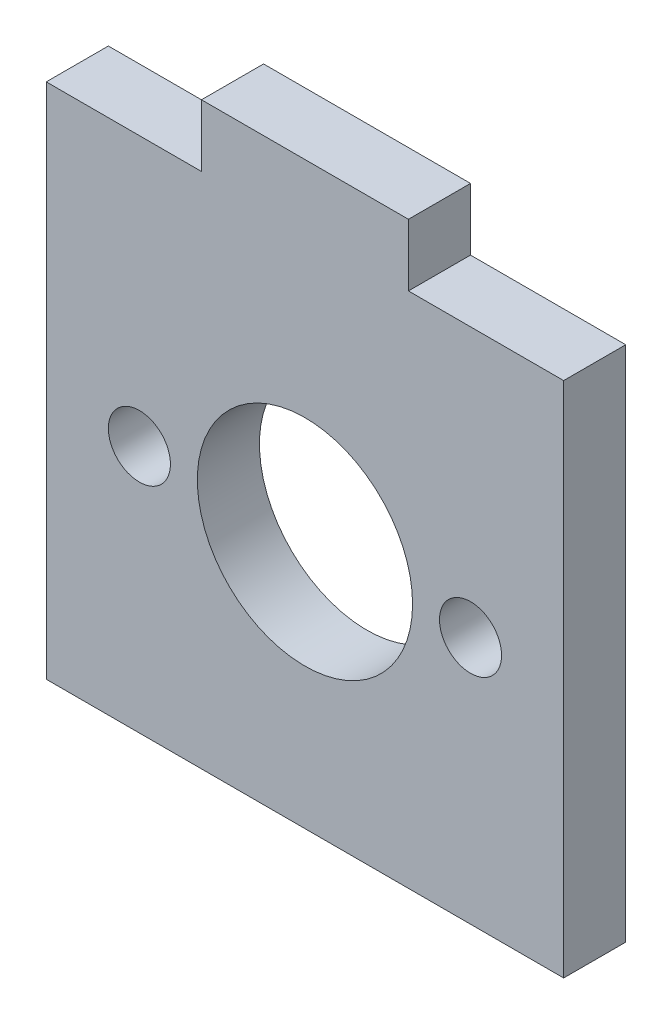
ISO-10303-21;
HEADER;
FILE_DESCRIPTION(('STEP AP214'),'2;1');
FILE_NAME('part.step','',(''),(''),'','','');
FILE_SCHEMA(('AUTOMOTIVE_DESIGN { 1 0 10303 214 1 1 1 1 }'));
ENDSEC;
DATA;
#1=APPLICATION_CONTEXT('core data for automotive mechanical design processes');
#2=APPLICATION_PROTOCOL_DEFINITION('international standard','automotive_design',2000,#1);
#3=PRODUCT_CONTEXT('',#1,'mechanical');
#4=PRODUCT('Part','Part','',(#3));
#5=PRODUCT_RELATED_PRODUCT_CATEGORY('part','',(#4));
#6=PRODUCT_DEFINITION_FORMATION('','',#4);
#7=PRODUCT_DEFINITION_CONTEXT('part definition',#1,'design');
#8=PRODUCT_DEFINITION('design','',#6,#7);
#9=PRODUCT_DEFINITION_SHAPE('','',#8);
#10=(LENGTH_UNIT() NAMED_UNIT(*) SI_UNIT(.MILLI.,.METRE.));
#11=(NAMED_UNIT(*) PLANE_ANGLE_UNIT() SI_UNIT($,.RADIAN.));
#12=(NAMED_UNIT(*) SI_UNIT($,.STERADIAN.) SOLID_ANGLE_UNIT());
#13=UNCERTAINTY_MEASURE_WITH_UNIT(LENGTH_MEASURE(1.E-05),#10,'distance_accuracy_value','');
#14=(GEOMETRIC_REPRESENTATION_CONTEXT(3) GLOBAL_UNCERTAINTY_ASSIGNED_CONTEXT((#13)) GLOBAL_UNIT_ASSIGNED_CONTEXT((#10,
#11,#12)) REPRESENTATION_CONTEXT('',''));
#15=CARTESIAN_POINT('',(0.,0.,0.));
#16=DIRECTION('',(0.,0.,1.));
#17=DIRECTION('',(1.,0.,0.));
#18=AXIS2_PLACEMENT_3D('',#15,#16,#17);
#19=CARTESIAN_POINT('',(0.,0.,3.));
#20=DIRECTION('',(0.,0.,1.));
#21=DIRECTION('',(1.,0.,0.));
#22=AXIS2_PLACEMENT_3D('',#19,#20,#21);
#23=PLANE('',#22);
#24=CARTESIAN_POINT('',(-8.,0.,3.));
#25=DIRECTION('',(0.,0.,1.));
#26=DIRECTION('',(1.,0.,0.));
#27=AXIS2_PLACEMENT_3D('',#24,#25,#26);
#28=CIRCLE('',#27,1.5);
#29=CARTESIAN_POINT('',(-6.5,0.,3.));
#30=VERTEX_POINT('',#29);
#31=EDGE_CURVE('E213',#30,#30,#28,.T.);
#32=ORIENTED_EDGE('',*,*,#31,.F.);
#33=EDGE_LOOP('',(#32));
#34=FACE_BOUND('',#33,.T.);
#35=DIRECTION('',(-1.,0.,0.));
#36=VECTOR('',#35,1.);
#37=CARTESIAN_POINT('',(-5.,13.,3.));
#38=LINE('',#37,#36);
#39=CARTESIAN_POINT('',(-5.,13.,3.));
#40=VERTEX_POINT('',#39);
#41=CARTESIAN_POINT('',(-12.5,13.,3.));
#42=VERTEX_POINT('',#41);
#43=EDGE_CURVE('E164',#40,#42,#38,.T.);
#44=ORIENTED_EDGE('',*,*,#43,.T.);
#45=DIRECTION('',(0.,-1.,0.));
#46=VECTOR('',#45,1.);
#47=CARTESIAN_POINT('',(-12.5,13.,3.));
#48=LINE('',#47,#46);
#49=CARTESIAN_POINT('',(-12.5,-12.,3.));
#50=VERTEX_POINT('',#49);
#51=EDGE_CURVE('E100',#42,#50,#48,.T.);
#52=ORIENTED_EDGE('',*,*,#51,.T.);
#53=DIRECTION('',(1.,0.,0.));
#54=VECTOR('',#53,1.);
#55=CARTESIAN_POINT('',(-12.5,-12.,3.));
#56=LINE('',#55,#54);
#57=CARTESIAN_POINT('',(12.5,-12.,3.));
#58=VERTEX_POINT('',#57);
#59=EDGE_CURVE('E185',#50,#58,#56,.T.);
#60=ORIENTED_EDGE('',*,*,#59,.T.);
#61=DIRECTION('',(0.,1.,0.));
#62=VECTOR('',#61,1.);
#63=CARTESIAN_POINT('',(12.5,-12.,3.));
#64=LINE('',#63,#62);
#65=CARTESIAN_POINT('',(12.5,13.,3.));
#66=VERTEX_POINT('',#65);
#67=EDGE_CURVE('E199',#58,#66,#64,.T.);
#68=ORIENTED_EDGE('',*,*,#67,.T.);
#69=DIRECTION('',(-1.,0.,0.));
#70=VECTOR('',#69,1.);
#71=CARTESIAN_POINT('',(12.5,13.,3.));
#72=LINE('',#71,#70);
#73=CARTESIAN_POINT('',(5.,13.,3.));
#74=VERTEX_POINT('',#73);
#75=EDGE_CURVE('E119',#66,#74,#72,.T.);
#76=ORIENTED_EDGE('',*,*,#75,.T.);
#77=DIRECTION('',(0.,1.,0.));
#78=VECTOR('',#77,1.);
#79=CARTESIAN_POINT('',(5.,16.,3.));
#80=LINE('',#79,#78);
#81=CARTESIAN_POINT('',(5.,16.,3.));
#82=VERTEX_POINT('',#81);
#83=EDGE_CURVE('E113',#74,#82,#80,.T.);
#84=ORIENTED_EDGE('',*,*,#83,.T.);
#85=DIRECTION('',(-1.,0.,0.));
#86=VECTOR('',#85,1.);
#87=CARTESIAN_POINT('',(-5.,16.,3.));
#88=LINE('',#87,#86);
#89=CARTESIAN_POINT('',(-5.,16.,3.));
#90=VERTEX_POINT('',#89);
#91=EDGE_CURVE('E117',#82,#90,#88,.T.);
#92=ORIENTED_EDGE('',*,*,#91,.T.);
#93=DIRECTION('',(0.,-1.,0.));
#94=VECTOR('',#93,1.);
#95=CARTESIAN_POINT('',(-5.,13.,3.));
#96=LINE('',#95,#94);
#97=EDGE_CURVE('E57',#90,#40,#96,.T.);
#98=ORIENTED_EDGE('',*,*,#97,.T.);
#99=EDGE_LOOP('',(#44,#52,#60,#68,#76,#84,#92,#98));
#100=FACE_BOUND('',#99,.T.);
#101=CARTESIAN_POINT('',(0.,0.,3.));
#102=DIRECTION('',(0.,0.,1.));
#103=DIRECTION('',(1.,0.,0.));
#104=AXIS2_PLACEMENT_3D('',#101,#102,#103);
#105=CIRCLE('',#104,5.2);
#106=CARTESIAN_POINT('',(5.2,0.,3.));
#107=VERTEX_POINT('',#106);
#108=EDGE_CURVE('E146',#107,#107,#105,.T.);
#109=ORIENTED_EDGE('',*,*,#108,.F.);
#110=EDGE_LOOP('',(#109));
#111=FACE_BOUND('',#110,.T.);
#112=CARTESIAN_POINT('',(8.,0.,3.));
#113=DIRECTION('',(0.,0.,1.));
#114=DIRECTION('',(1.,0.,0.));
#115=AXIS2_PLACEMENT_3D('',#112,#113,#114);
#116=CIRCLE('',#115,1.5);
#117=CARTESIAN_POINT('',(9.5,0.,3.));
#118=VERTEX_POINT('',#117);
#119=EDGE_CURVE('E221',#118,#118,#116,.T.);
#120=ORIENTED_EDGE('',*,*,#119,.F.);
#121=EDGE_LOOP('',(#120));
#122=FACE_BOUND('',#121,.T.);
#123=ADVANCED_FACE('F39',(#34,#100,#111,#122),#23,.T.);
#124=CARTESIAN_POINT('',(0.,0.,0.));
#125=DIRECTION('',(0.,0.,1.));
#126=DIRECTION('',(1.,0.,0.));
#127=AXIS2_PLACEMENT_3D('',#124,#125,#126);
#128=PLANE('',#127);
#129=DIRECTION('',(-1.,0.,0.));
#130=VECTOR('',#129,1.);
#131=CARTESIAN_POINT('',(-5.,13.,0.));
#132=LINE('',#131,#130);
#133=CARTESIAN_POINT('',(-5.,13.,0.));
#134=VERTEX_POINT('',#133);
#135=CARTESIAN_POINT('',(-12.5,13.,0.));
#136=VERTEX_POINT('',#135);
#137=EDGE_CURVE('E141',#134,#136,#132,.T.);
#138=ORIENTED_EDGE('',*,*,#137,.F.);
#139=DIRECTION('',(0.,-1.,0.));
#140=VECTOR('',#139,1.);
#141=CARTESIAN_POINT('',(-5.,13.,0.));
#142=LINE('',#141,#140);
#143=CARTESIAN_POINT('',(-5.,16.,0.));
#144=VERTEX_POINT('',#143);
#145=EDGE_CURVE('E92',#144,#134,#142,.T.);
#146=ORIENTED_EDGE('',*,*,#145,.F.);
#147=DIRECTION('',(-1.,0.,0.));
#148=VECTOR('',#147,1.);
#149=CARTESIAN_POINT('',(-5.,16.,0.));
#150=LINE('',#149,#148);
#151=CARTESIAN_POINT('',(5.,16.,0.));
#152=VERTEX_POINT('',#151);
#153=EDGE_CURVE('E86',#152,#144,#150,.T.);
#154=ORIENTED_EDGE('',*,*,#153,.F.);
#155=DIRECTION('',(0.,1.,0.));
#156=VECTOR('',#155,1.);
#157=CARTESIAN_POINT('',(5.,16.,0.));
#158=LINE('',#157,#156);
#159=CARTESIAN_POINT('',(5.,13.,0.));
#160=VERTEX_POINT('',#159);
#161=EDGE_CURVE('E128',#160,#152,#158,.T.);
#162=ORIENTED_EDGE('',*,*,#161,.F.);
#163=DIRECTION('',(-1.,0.,0.));
#164=VECTOR('',#163,1.);
#165=CARTESIAN_POINT('',(12.5,13.,0.));
#166=LINE('',#165,#164);
#167=CARTESIAN_POINT('',(12.5,13.,0.));
#168=VERTEX_POINT('',#167);
#169=EDGE_CURVE('E155',#168,#160,#166,.T.);
#170=ORIENTED_EDGE('',*,*,#169,.F.);
#171=DIRECTION('',(0.,1.,0.));
#172=VECTOR('',#171,1.);
#173=CARTESIAN_POINT('',(12.5,-12.,0.));
#174=LINE('',#173,#172);
#175=CARTESIAN_POINT('',(12.5,-12.,0.));
#176=VERTEX_POINT('',#175);
#177=EDGE_CURVE('E152',#176,#168,#174,.T.);
#178=ORIENTED_EDGE('',*,*,#177,.F.);
#179=DIRECTION('',(1.,0.,0.));
#180=VECTOR('',#179,1.);
#181=CARTESIAN_POINT('',(-12.5,-12.,0.));
#182=LINE('',#181,#180);
#183=CARTESIAN_POINT('',(-12.5,-12.,0.));
#184=VERTEX_POINT('',#183);
#185=EDGE_CURVE('E149',#184,#176,#182,.T.);
#186=ORIENTED_EDGE('',*,*,#185,.F.);
#187=DIRECTION('',(0.,-1.,0.));
#188=VECTOR('',#187,1.);
#189=CARTESIAN_POINT('',(-12.5,13.,0.));
#190=LINE('',#189,#188);
#191=EDGE_CURVE('E145',#136,#184,#190,.T.);
#192=ORIENTED_EDGE('',*,*,#191,.F.);
#193=EDGE_LOOP('',(#138,#146,#154,#162,#170,#178,#186,#192));
#194=FACE_BOUND('',#193,.T.);
#195=CARTESIAN_POINT('',(0.,0.,0.));
#196=DIRECTION('',(0.,0.,1.));
#197=DIRECTION('',(1.,0.,0.));
#198=AXIS2_PLACEMENT_3D('',#195,#196,#197);
#199=CIRCLE('',#198,5.2);
#200=CARTESIAN_POINT('',(5.2,0.,0.));
#201=VERTEX_POINT('',#200);
#202=EDGE_CURVE('E209',#201,#201,#199,.T.);
#203=ORIENTED_EDGE('',*,*,#202,.T.);
#204=EDGE_LOOP('',(#203));
#205=FACE_BOUND('',#204,.T.);
#206=CARTESIAN_POINT('',(-8.,0.,0.));
#207=DIRECTION('',(0.,0.,1.));
#208=DIRECTION('',(1.,0.,0.));
#209=AXIS2_PLACEMENT_3D('',#206,#207,#208);
#210=CIRCLE('',#209,1.5);
#211=CARTESIAN_POINT('',(-6.5,0.,0.));
#212=VERTEX_POINT('',#211);
#213=EDGE_CURVE('E217',#212,#212,#210,.T.);
#214=ORIENTED_EDGE('',*,*,#213,.T.);
#215=EDGE_LOOP('',(#214));
#216=FACE_BOUND('',#215,.T.);
#217=CARTESIAN_POINT('',(8.,0.,0.));
#218=DIRECTION('',(0.,0.,1.));
#219=DIRECTION('',(1.,0.,0.));
#220=AXIS2_PLACEMENT_3D('',#217,#218,#219);
#221=CIRCLE('',#220,1.5);
#222=CARTESIAN_POINT('',(9.5,0.,0.));
#223=VERTEX_POINT('',#222);
#224=EDGE_CURVE('E225',#223,#223,#221,.T.);
#225=ORIENTED_EDGE('',*,*,#224,.T.);
#226=EDGE_LOOP('',(#225));
#227=FACE_BOUND('',#226,.T.);
#228=ADVANCED_FACE('F189',(#194,#205,#216,#227),#128,.F.);
#229=CARTESIAN_POINT('',(-5.,13.,3.));
#230=DIRECTION('',(0.,-1.,0.));
#231=DIRECTION('',(1.,0.,0.));
#232=AXIS2_PLACEMENT_3D('',#229,#230,#231);
#233=PLANE('',#232);
#234=ORIENTED_EDGE('',*,*,#137,.T.);
#235=DIRECTION('',(0.,0.,-1.));
#236=VECTOR('',#235,1.);
#237=CARTESIAN_POINT('',(-12.5,13.,3.));
#238=LINE('',#237,#236);
#239=EDGE_CURVE('E11',#42,#136,#238,.T.);
#240=ORIENTED_EDGE('',*,*,#239,.F.);
#241=ORIENTED_EDGE('',*,*,#43,.F.);
#242=DIRECTION('',(0.,0.,-1.));
#243=VECTOR('',#242,1.);
#244=CARTESIAN_POINT('',(-5.,13.,3.));
#245=LINE('',#244,#243);
#246=EDGE_CURVE('E137',#40,#134,#245,.T.);
#247=ORIENTED_EDGE('',*,*,#246,.T.);
#248=EDGE_LOOP('',(#234,#240,#241,#247));
#249=FACE_BOUND('',#248,.T.);
#250=ADVANCED_FACE('F41',(#249),#233,.F.);
#251=CARTESIAN_POINT('',(-12.5,13.,3.));
#252=DIRECTION('',(1.,0.,0.));
#253=DIRECTION('',(0.,1.,0.));
#254=AXIS2_PLACEMENT_3D('',#251,#252,#253);
#255=PLANE('',#254);
#256=ORIENTED_EDGE('',*,*,#191,.T.);
#257=DIRECTION('',(0.,0.,-1.));
#258=VECTOR('',#257,1.);
#259=CARTESIAN_POINT('',(-12.5,-12.,3.));
#260=LINE('',#259,#258);
#261=EDGE_CURVE('E49',#50,#184,#260,.T.);
#262=ORIENTED_EDGE('',*,*,#261,.F.);
#263=ORIENTED_EDGE('',*,*,#51,.F.);
#264=ORIENTED_EDGE('',*,*,#239,.T.);
#265=EDGE_LOOP('',(#256,#262,#263,#264));
#266=FACE_BOUND('',#265,.T.);
#267=ADVANCED_FACE('F260',(#266),#255,.F.);
#268=CARTESIAN_POINT('',(-12.5,-12.,3.));
#269=DIRECTION('',(0.,1.,0.));
#270=DIRECTION('',(0.,0.,1.));
#271=AXIS2_PLACEMENT_3D('',#268,#269,#270);
#272=PLANE('',#271);
#273=ORIENTED_EDGE('',*,*,#185,.T.);
#274=DIRECTION('',(0.,0.,-1.));
#275=VECTOR('',#274,1.);
#276=CARTESIAN_POINT('',(12.5,-12.,3.));
#277=LINE('',#276,#275);
#278=EDGE_CURVE('E175',#58,#176,#277,.T.);
#279=ORIENTED_EDGE('',*,*,#278,.F.);
#280=ORIENTED_EDGE('',*,*,#59,.F.);
#281=ORIENTED_EDGE('',*,*,#261,.T.);
#282=EDGE_LOOP('',(#273,#279,#280,#281));
#283=FACE_BOUND('',#282,.T.);
#284=ADVANCED_FACE('F183',(#283),#272,.F.);
#285=CARTESIAN_POINT('',(12.5,-12.,3.));
#286=DIRECTION('',(-1.,0.,0.));
#287=DIRECTION('',(0.,-1.,0.));
#288=AXIS2_PLACEMENT_3D('',#285,#286,#287);
#289=PLANE('',#288);
#290=ORIENTED_EDGE('',*,*,#177,.T.);
#291=DIRECTION('',(0.,0.,-1.));
#292=VECTOR('',#291,1.);
#293=CARTESIAN_POINT('',(12.5,13.,3.));
#294=LINE('',#293,#292);
#295=EDGE_CURVE('E171',#66,#168,#294,.T.);
#296=ORIENTED_EDGE('',*,*,#295,.F.);
#297=ORIENTED_EDGE('',*,*,#67,.F.);
#298=ORIENTED_EDGE('',*,*,#278,.T.);
#299=EDGE_LOOP('',(#290,#296,#297,#298));
#300=FACE_BOUND('',#299,.T.);
#301=ADVANCED_FACE('F194',(#300),#289,.F.);
#302=CARTESIAN_POINT('',(12.5,13.,3.));
#303=DIRECTION('',(0.,-1.,0.));
#304=DIRECTION('',(0.,0.,-1.));
#305=AXIS2_PLACEMENT_3D('',#302,#303,#304);
#306=PLANE('',#305);
#307=ORIENTED_EDGE('',*,*,#169,.T.);
#308=DIRECTION('',(0.,0.,-1.));
#309=VECTOR('',#308,1.);
#310=CARTESIAN_POINT('',(5.,13.,3.));
#311=LINE('',#310,#309);
#312=EDGE_CURVE('E130',#74,#160,#311,.T.);
#313=ORIENTED_EDGE('',*,*,#312,.F.);
#314=ORIENTED_EDGE('',*,*,#75,.F.);
#315=ORIENTED_EDGE('',*,*,#295,.T.);
#316=EDGE_LOOP('',(#307,#313,#314,#315));
#317=FACE_BOUND('',#316,.T.);
#318=ADVANCED_FACE('F197',(#317),#306,.F.);
#319=CARTESIAN_POINT('',(5.,16.,3.));
#320=DIRECTION('',(-1.,0.,0.));
#321=DIRECTION('',(0.,0.,1.));
#322=AXIS2_PLACEMENT_3D('',#319,#320,#321);
#323=PLANE('',#322);
#324=ORIENTED_EDGE('',*,*,#161,.T.);
#325=DIRECTION('',(0.,0.,-1.));
#326=VECTOR('',#325,1.);
#327=CARTESIAN_POINT('',(5.,16.,3.));
#328=LINE('',#327,#326);
#329=EDGE_CURVE('E125',#82,#152,#328,.T.);
#330=ORIENTED_EDGE('',*,*,#329,.F.);
#331=ORIENTED_EDGE('',*,*,#83,.F.);
#332=ORIENTED_EDGE('',*,*,#312,.T.);
#333=EDGE_LOOP('',(#324,#330,#331,#332));
#334=FACE_BOUND('',#333,.T.);
#335=ADVANCED_FACE('F126',(#334),#323,.F.);
#336=CARTESIAN_POINT('',(-5.,16.,3.));
#337=DIRECTION('',(0.,-1.,0.));
#338=DIRECTION('',(1.,0.,0.));
#339=AXIS2_PLACEMENT_3D('',#336,#337,#338);
#340=PLANE('',#339);
#341=ORIENTED_EDGE('',*,*,#153,.T.);
#342=DIRECTION('',(0.,0.,-1.));
#343=VECTOR('',#342,1.);
#344=CARTESIAN_POINT('',(-5.,16.,3.));
#345=LINE('',#344,#343);
#346=EDGE_CURVE('E131',#90,#144,#345,.T.);
#347=ORIENTED_EDGE('',*,*,#346,.F.);
#348=ORIENTED_EDGE('',*,*,#91,.F.);
#349=ORIENTED_EDGE('',*,*,#329,.T.);
#350=EDGE_LOOP('',(#341,#347,#348,#349));
#351=FACE_BOUND('',#350,.T.);
#352=ADVANCED_FACE('F133',(#351),#340,.F.);
#353=CARTESIAN_POINT('',(-5.,13.,3.));
#354=DIRECTION('',(1.,0.,0.));
#355=DIRECTION('',(0.,1.,0.));
#356=AXIS2_PLACEMENT_3D('',#353,#354,#355);
#357=PLANE('',#356);
#358=ORIENTED_EDGE('',*,*,#145,.T.);
#359=ORIENTED_EDGE('',*,*,#246,.F.);
#360=ORIENTED_EDGE('',*,*,#97,.F.);
#361=ORIENTED_EDGE('',*,*,#346,.T.);
#362=EDGE_LOOP('',(#358,#359,#360,#361));
#363=FACE_BOUND('',#362,.T.);
#364=ADVANCED_FACE('F248',(#363),#357,.F.);
#365=CARTESIAN_POINT('',(0.,0.,3.));
#366=DIRECTION('',(0.,0.,-1.));
#367=DIRECTION('',(-1.,0.,0.));
#368=AXIS2_PLACEMENT_3D('',#365,#366,#367);
#369=CYLINDRICAL_SURFACE('',#368,5.2);
#370=ORIENTED_EDGE('',*,*,#108,.T.);
#371=EDGE_LOOP('',(#370));
#372=FACE_BOUND('',#371,.T.);
#373=ORIENTED_EDGE('',*,*,#202,.F.);
#374=EDGE_LOOP('',(#373));
#375=FACE_BOUND('',#374,.T.);
#376=ADVANCED_FACE('F245',(#372,#375),#369,.F.);
#377=CARTESIAN_POINT('',(-8.,0.,3.));
#378=DIRECTION('',(0.,0.,-1.));
#379=DIRECTION('',(-1.,0.,0.));
#380=AXIS2_PLACEMENT_3D('',#377,#378,#379);
#381=CYLINDRICAL_SURFACE('',#380,1.5);
#382=ORIENTED_EDGE('',*,*,#31,.T.);
#383=EDGE_LOOP('',(#382));
#384=FACE_BOUND('',#383,.T.);
#385=ORIENTED_EDGE('',*,*,#213,.F.);
#386=EDGE_LOOP('',(#385));
#387=FACE_BOUND('',#386,.T.);
#388=ADVANCED_FACE('F324',(#384,#387),#381,.F.);
#389=CARTESIAN_POINT('',(8.,0.,3.));
#390=DIRECTION('',(0.,0.,-1.));
#391=DIRECTION('',(-1.,0.,0.));
#392=AXIS2_PLACEMENT_3D('',#389,#390,#391);
#393=CYLINDRICAL_SURFACE('',#392,1.5);
#394=ORIENTED_EDGE('',*,*,#119,.T.);
#395=EDGE_LOOP('',(#394));
#396=FACE_BOUND('',#395,.T.);
#397=ORIENTED_EDGE('',*,*,#224,.F.);
#398=EDGE_LOOP('',(#397));
#399=FACE_BOUND('',#398,.T.);
#400=ADVANCED_FACE('F233',(#396,#399),#393,.F.);
#401=CLOSED_SHELL('',(#123,#228,#250,#267,#284,#301,#318,#335,#352,#364,#376,#388,#400));
#402=MANIFOLD_SOLID_BREP('B2',#401);
#403=ADVANCED_BREP_SHAPE_REPRESENTATION('',(#18,#402),#14);
#404=SHAPE_DEFINITION_REPRESENTATION(#9,#403);
ENDSEC;
END-ISO-10303-21;
